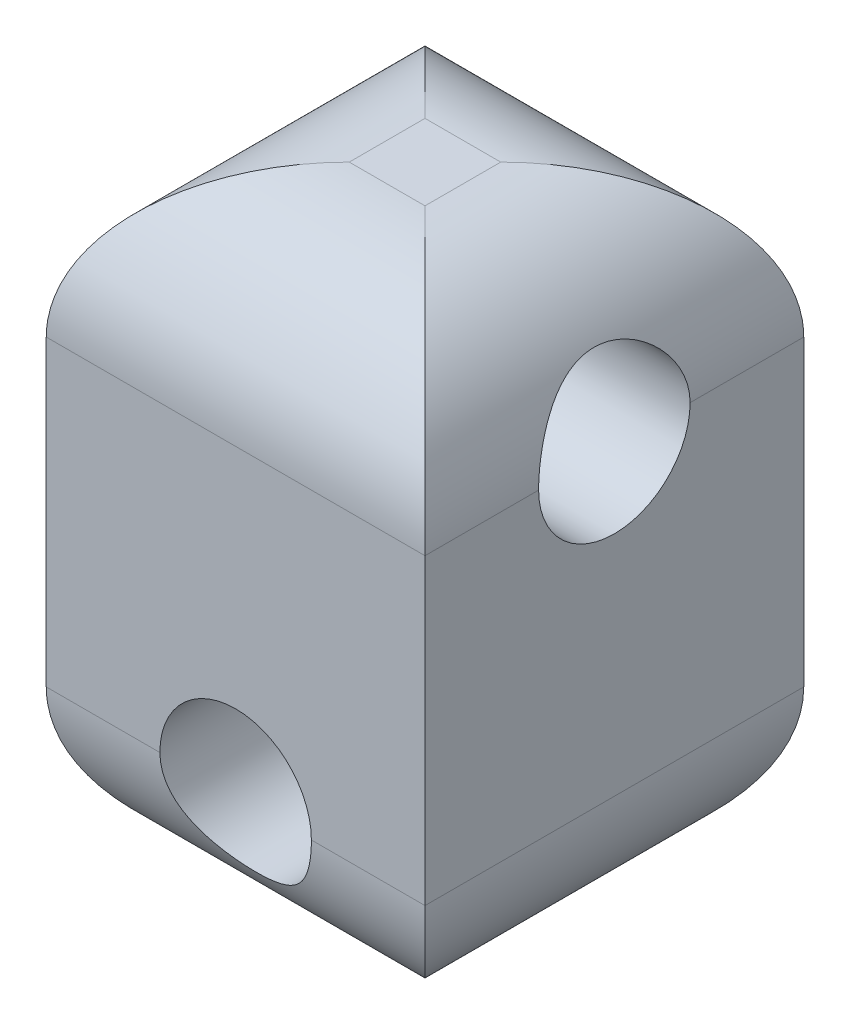
ISO-10303-21;
HEADER;
FILE_DESCRIPTION(('STEP AP214'),'2;1');
FILE_NAME('part.step','',(''),(''),'','','');
FILE_SCHEMA(('AUTOMOTIVE_DESIGN { 1 0 10303 214 1 1 1 1 }'));
ENDSEC;
DATA;
#1=APPLICATION_CONTEXT('core data for automotive mechanical design processes');
#2=APPLICATION_PROTOCOL_DEFINITION('international standard','automotive_design',2000,#1);
#3=PRODUCT_CONTEXT('',#1,'mechanical');
#4=PRODUCT('Part','Part','',(#3));
#5=PRODUCT_RELATED_PRODUCT_CATEGORY('part','',(#4));
#6=PRODUCT_DEFINITION_FORMATION('','',#4);
#7=PRODUCT_DEFINITION_CONTEXT('part definition',#1,'design');
#8=PRODUCT_DEFINITION('design','',#6,#7);
#9=PRODUCT_DEFINITION_SHAPE('','',#8);
#10=(LENGTH_UNIT() NAMED_UNIT(*) SI_UNIT(.MILLI.,.METRE.));
#11=(NAMED_UNIT(*) PLANE_ANGLE_UNIT() SI_UNIT($,.RADIAN.));
#12=(NAMED_UNIT(*) SI_UNIT($,.STERADIAN.) SOLID_ANGLE_UNIT());
#13=UNCERTAINTY_MEASURE_WITH_UNIT(LENGTH_MEASURE(1.E-05),#10,'distance_accuracy_value','');
#14=(GEOMETRIC_REPRESENTATION_CONTEXT(3) GLOBAL_UNCERTAINTY_ASSIGNED_CONTEXT((#13)) GLOBAL_UNIT_ASSIGNED_CONTEXT((#10,
#11,#12)) REPRESENTATION_CONTEXT('',''));
#15=CARTESIAN_POINT('',(0.,0.,0.));
#16=DIRECTION('',(0.,0.,1.));
#17=DIRECTION('',(1.,0.,0.));
#18=AXIS2_PLACEMENT_3D('',#15,#16,#17);
#19=CARTESIAN_POINT('',(-3.31347299634826,5.72314049586777,2.5));
#20=DIRECTION('',(1.,0.,0.));
#21=DIRECTION('',(0.,1.,0.));
#22=AXIS2_PLACEMENT_3D('',#19,#20,#21);
#23=PLANE('',#22);
#24=DIRECTION('',(0.,-1.,0.));
#25=VECTOR('',#24,1.);
#26=CARTESIAN_POINT('',(-3.31347299634826,5.72314049586777,2.5));
#27=LINE('',#26,#25);
#28=CARTESIAN_POINT('',(-3.31347299634826,4.72314049586777,2.5));
#29=VERTEX_POINT('',#28);
#30=CARTESIAN_POINT('',(-3.31347299634825,2.72314049586777,2.5));
#31=VERTEX_POINT('',#30);
#32=EDGE_CURVE('E341',#29,#31,#27,.T.);
#33=ORIENTED_EDGE('',*,*,#32,.F.);
#34=DIRECTION('',(0.,0.,-1.));
#35=VECTOR('',#34,1.);
#36=CARTESIAN_POINT('',(-3.31347299634826,4.72314049586777,2.5));
#37=LINE('',#36,#35);
#38=CARTESIAN_POINT('',(-3.31347299634825,4.72314049586777,1.75));
#39=VERTEX_POINT('',#38);
#40=EDGE_CURVE('E147',#29,#39,#37,.T.);
#41=ORIENTED_EDGE('',*,*,#40,.T.);
#42=CARTESIAN_POINT('',(-3.31347299634825,4.72314049586777,1.25));
#43=DIRECTION('',(1.,0.,0.));
#44=DIRECTION('',(0.,1.,0.));
#45=AXIS2_PLACEMENT_3D('',#42,#43,#44);
#46=CIRCLE('',#45,0.500000000000001);
#47=CARTESIAN_POINT('',(-3.31347299634825,4.72314049586777,0.749999999999999));
#48=VERTEX_POINT('',#47);
#49=EDGE_CURVE('E143',#39,#48,#46,.T.);
#50=ORIENTED_EDGE('',*,*,#49,.T.);
#51=DIRECTION('',(0.,0.,-1.));
#52=VECTOR('',#51,1.);
#53=CARTESIAN_POINT('',(-3.31347299634826,4.72314049586777,2.5));
#54=LINE('',#53,#52);
#55=CARTESIAN_POINT('',(-3.31347299634826,4.72314049586777,0.));
#56=VERTEX_POINT('',#55);
#57=EDGE_CURVE('E136',#48,#56,#54,.T.);
#58=ORIENTED_EDGE('',*,*,#57,.T.);
#59=DIRECTION('',(0.,-1.,0.));
#60=VECTOR('',#59,1.);
#61=CARTESIAN_POINT('',(-3.31347299634826,5.72314049586777,0.));
#62=LINE('',#61,#60);
#63=CARTESIAN_POINT('',(-3.31347299634825,2.72314049586777,0.));
#64=VERTEX_POINT('',#63);
#65=EDGE_CURVE('E140',#56,#64,#62,.T.);
#66=ORIENTED_EDGE('',*,*,#65,.T.);
#67=DIRECTION('',(0.,0.,-1.));
#68=VECTOR('',#67,1.);
#69=CARTESIAN_POINT('',(-3.31347299634825,2.72314049586777,2.5));
#70=LINE('',#69,#68);
#71=EDGE_CURVE('E169',#64,#31,#70,.F.);
#72=ORIENTED_EDGE('',*,*,#71,.T.);
#73=EDGE_LOOP('',(#33,#41,#50,#58,#66,#72));
#74=FACE_BOUND('',#73,.T.);
#75=ADVANCED_FACE('F43',(#74),#23,.F.);
#76=CARTESIAN_POINT('',(-3.31347299634825,1.72314049586777,2.5));
#77=DIRECTION('',(0.,1.,0.));
#78=DIRECTION('',(0.,0.,1.));
#79=AXIS2_PLACEMENT_3D('',#76,#77,#78);
#80=PLANE('',#79);
#81=DIRECTION('',(0.,0.,-1.));
#82=VECTOR('',#81,1.);
#83=CARTESIAN_POINT('',(-1.81347299634825,1.72314049586777,2.5));
#84=LINE('',#83,#82);
#85=CARTESIAN_POINT('',(-1.81347299634825,1.72314049586777,1.));
#86=VERTEX_POINT('',#85);
#87=CARTESIAN_POINT('',(-1.81347299634825,1.72314049586777,1.5));
#88=VERTEX_POINT('',#87);
#89=EDGE_CURVE('E329',#86,#88,#84,.F.);
#90=ORIENTED_EDGE('',*,*,#89,.T.);
#91=DIRECTION('',(1.,0.,0.));
#92=VECTOR('',#91,1.);
#93=CARTESIAN_POINT('',(-2.31347299634825,1.72314049586777,1.5));
#94=LINE('',#93,#92);
#95=CARTESIAN_POINT('',(-2.31347299634825,1.72314049586777,1.5));
#96=VERTEX_POINT('',#95);
#97=EDGE_CURVE('E67',#88,#96,#94,.F.);
#98=ORIENTED_EDGE('',*,*,#97,.T.);
#99=DIRECTION('',(0.,0.,-1.));
#100=VECTOR('',#99,1.);
#101=CARTESIAN_POINT('',(-2.31347299634825,1.72314049586777,2.5));
#102=LINE('',#101,#100);
#103=CARTESIAN_POINT('',(-2.31347299634825,1.72314049586777,1.));
#104=VERTEX_POINT('',#103);
#105=EDGE_CURVE('E170',#96,#104,#102,.T.);
#106=ORIENTED_EDGE('',*,*,#105,.T.);
#107=DIRECTION('',(1.,0.,0.));
#108=VECTOR('',#107,1.);
#109=CARTESIAN_POINT('',(-3.31347299634825,1.72314049586777,1.));
#110=LINE('',#109,#108);
#111=EDGE_CURVE('E319',#104,#86,#110,.T.);
#112=ORIENTED_EDGE('',*,*,#111,.T.);
#113=EDGE_LOOP('',(#90,#98,#106,#112));
#114=FACE_BOUND('',#113,.T.);
#115=ADVANCED_FACE('F233',(#114),#80,.F.);
#116=CARTESIAN_POINT('',(-0.813472996348255,5.72314049586777,2.5));
#117=DIRECTION('',(-1.,0.,0.));
#118=DIRECTION('',(0.,-1.,0.));
#119=AXIS2_PLACEMENT_3D('',#116,#117,#118);
#120=PLANE('',#119);
#121=DIRECTION('',(0.,1.,0.));
#122=VECTOR('',#121,1.);
#123=CARTESIAN_POINT('',(-0.813472996348255,5.72314049586777,0.));
#124=LINE('',#123,#122);
#125=CARTESIAN_POINT('',(-0.813472996348255,2.72314049586777,0.));
#126=VERTEX_POINT('',#125);
#127=CARTESIAN_POINT('',(-0.813472996348255,4.72314049586777,0.));
#128=VERTEX_POINT('',#127);
#129=EDGE_CURVE('E160',#126,#128,#124,.T.);
#130=ORIENTED_EDGE('',*,*,#129,.T.);
#131=DIRECTION('',(0.,0.,-1.));
#132=VECTOR('',#131,1.);
#133=CARTESIAN_POINT('',(-0.813472996348255,4.72314049586777,2.5));
#134=LINE('',#133,#132);
#135=CARTESIAN_POINT('',(-0.813472996348255,4.72314049586777,0.749999999999999));
#136=VERTEX_POINT('',#135);
#137=EDGE_CURVE('E189',#128,#136,#134,.F.);
#138=ORIENTED_EDGE('',*,*,#137,.T.);
#139=CARTESIAN_POINT('',(-0.813472996348255,4.72314049586777,1.25));
#140=DIRECTION('',(1.,0.,0.));
#141=DIRECTION('',(0.,1.,0.));
#142=AXIS2_PLACEMENT_3D('',#139,#140,#141);
#143=CIRCLE('',#142,0.500000000000001);
#144=CARTESIAN_POINT('',(-0.813472996348255,4.72314049586777,1.75));
#145=VERTEX_POINT('',#144);
#146=EDGE_CURVE('E347',#145,#136,#143,.T.);
#147=ORIENTED_EDGE('',*,*,#146,.F.);
#148=DIRECTION('',(0.,0.,-1.));
#149=VECTOR('',#148,1.);
#150=CARTESIAN_POINT('',(-0.813472996348255,4.72314049586777,2.5));
#151=LINE('',#150,#149);
#152=CARTESIAN_POINT('',(-0.813472996348255,4.72314049586777,2.5));
#153=VERTEX_POINT('',#152);
#154=EDGE_CURVE('E181',#145,#153,#151,.F.);
#155=ORIENTED_EDGE('',*,*,#154,.T.);
#156=DIRECTION('',(0.,1.,0.));
#157=VECTOR('',#156,1.);
#158=CARTESIAN_POINT('',(-0.813472996348255,5.72314049586777,2.5));
#159=LINE('',#158,#157);
#160=CARTESIAN_POINT('',(-0.813472996348255,2.72314049586777,2.5));
#161=VERTEX_POINT('',#160);
#162=EDGE_CURVE('E334',#161,#153,#159,.T.);
#163=ORIENTED_EDGE('',*,*,#162,.F.);
#164=DIRECTION('',(0.,0.,-1.));
#165=VECTOR('',#164,1.);
#166=CARTESIAN_POINT('',(-0.813472996348255,2.72314049586777,2.5));
#167=LINE('',#166,#165);
#168=EDGE_CURVE('E328',#161,#126,#167,.T.);
#169=ORIENTED_EDGE('',*,*,#168,.T.);
#170=EDGE_LOOP('',(#130,#138,#147,#155,#163,#169));
#171=FACE_BOUND('',#170,.T.);
#172=ADVANCED_FACE('F229',(#171),#120,.F.);
#173=CARTESIAN_POINT('',(-3.31347299634826,5.72314049586777,2.5));
#174=DIRECTION('',(0.,-1.,0.));
#175=DIRECTION('',(0.,0.,-1.));
#176=AXIS2_PLACEMENT_3D('',#173,#174,#175);
#177=PLANE('',#176);
#178=DIRECTION('',(-1.,0.,0.));
#179=VECTOR('',#178,1.);
#180=CARTESIAN_POINT('',(-0.813472996348255,5.72314049586777,1.5));
#181=LINE('',#180,#179);
#182=CARTESIAN_POINT('',(-2.31347299634826,5.72314049586777,1.5));
#183=VERTEX_POINT('',#182);
#184=CARTESIAN_POINT('',(-1.81347299634826,5.72314049586777,1.5));
#185=VERTEX_POINT('',#184);
#186=EDGE_CURVE('E336',#183,#185,#181,.F.);
#187=ORIENTED_EDGE('',*,*,#186,.T.);
#188=DIRECTION('',(0.,0.,-1.));
#189=VECTOR('',#188,1.);
#190=CARTESIAN_POINT('',(-1.81347299634825,5.72314049586777,2.5));
#191=LINE('',#190,#189);
#192=CARTESIAN_POINT('',(-1.81347299634825,5.72314049586777,1.));
#193=VERTEX_POINT('',#192);
#194=EDGE_CURVE('E177',#185,#193,#191,.T.);
#195=ORIENTED_EDGE('',*,*,#194,.T.);
#196=DIRECTION('',(-1.,0.,0.));
#197=VECTOR('',#196,1.);
#198=CARTESIAN_POINT('',(-3.31347299634826,5.72314049586777,1.));
#199=LINE('',#198,#197);
#200=CARTESIAN_POINT('',(-2.31347299634826,5.72314049586777,1.));
#201=VERTEX_POINT('',#200);
#202=EDGE_CURVE('E374',#193,#201,#199,.T.);
#203=ORIENTED_EDGE('',*,*,#202,.T.);
#204=DIRECTION('',(0.,0.,-1.));
#205=VECTOR('',#204,1.);
#206=CARTESIAN_POINT('',(-2.31347299634826,5.72314049586777,2.5));
#207=LINE('',#206,#205);
#208=EDGE_CURVE('E175',#201,#183,#207,.F.);
#209=ORIENTED_EDGE('',*,*,#208,.T.);
#210=EDGE_LOOP('',(#187,#195,#203,#209));
#211=FACE_BOUND('',#210,.T.);
#212=ADVANCED_FACE('F222',(#211),#177,.F.);
#213=CARTESIAN_POINT('',(0.,0.,2.5));
#214=DIRECTION('',(0.,0.,1.));
#215=DIRECTION('',(1.,0.,0.));
#216=AXIS2_PLACEMENT_3D('',#213,#214,#215);
#217=PLANE('',#216);
#218=ORIENTED_EDGE('',*,*,#32,.T.);
#219=DIRECTION('',(1.,0.,0.));
#220=VECTOR('',#219,1.);
#221=CARTESIAN_POINT('',(-1.81347299634825,2.72314049586777,2.5));
#222=LINE('',#221,#220);
#223=CARTESIAN_POINT('',(-2.56347299634825,2.72314049586777,2.5));
#224=VERTEX_POINT('',#223);
#225=EDGE_CURVE('E280',#31,#224,#222,.T.);
#226=ORIENTED_EDGE('',*,*,#225,.T.);
#227=CARTESIAN_POINT('',(-2.06347299634825,2.72314049586777,2.5));
#228=DIRECTION('',(0.,0.,1.));
#229=DIRECTION('',(1.,0.,0.));
#230=AXIS2_PLACEMENT_3D('',#227,#228,#229);
#231=CIRCLE('',#230,0.5);
#232=CARTESIAN_POINT('',(-1.56347299634825,2.72314049586777,2.5));
#233=VERTEX_POINT('',#232);
#234=EDGE_CURVE('E348',#233,#224,#231,.T.);
#235=ORIENTED_EDGE('',*,*,#234,.F.);
#236=DIRECTION('',(1.,0.,0.));
#237=VECTOR('',#236,1.);
#238=CARTESIAN_POINT('',(-1.81347299634825,2.72314049586777,2.5));
#239=LINE('',#238,#237);
#240=EDGE_CURVE('E277',#233,#161,#239,.T.);
#241=ORIENTED_EDGE('',*,*,#240,.T.);
#242=ORIENTED_EDGE('',*,*,#162,.T.);
#243=DIRECTION('',(-1.,0.,0.));
#244=VECTOR('',#243,1.);
#245=CARTESIAN_POINT('',(-3.31347299634826,4.72314049586777,2.5));
#246=LINE('',#245,#244);
#247=EDGE_CURVE('E337',#153,#29,#246,.T.);
#248=ORIENTED_EDGE('',*,*,#247,.T.);
#249=EDGE_LOOP('',(#218,#226,#235,#241,#242,#248));
#250=FACE_BOUND('',#249,.T.);
#251=ADVANCED_FACE('F218',(#250),#217,.T.);
#252=CARTESIAN_POINT('',(0.,0.,0.));
#253=DIRECTION('',(0.,0.,1.));
#254=DIRECTION('',(1.,0.,0.));
#255=AXIS2_PLACEMENT_3D('',#252,#253,#254);
#256=PLANE('',#255);
#257=ORIENTED_EDGE('',*,*,#129,.F.);
#258=DIRECTION('',(1.,0.,0.));
#259=VECTOR('',#258,1.);
#260=CARTESIAN_POINT('',(0.,2.72314049586777,0.));
#261=LINE('',#260,#259);
#262=CARTESIAN_POINT('',(-1.56347299634825,2.72314049586777,0.));
#263=VERTEX_POINT('',#262);
#264=EDGE_CURVE('E11',#126,#263,#261,.F.);
#265=ORIENTED_EDGE('',*,*,#264,.T.);
#266=CARTESIAN_POINT('',(-2.06347299634825,2.72314049586777,0.));
#267=DIRECTION('',(0.,0.,1.));
#268=DIRECTION('',(1.,0.,0.));
#269=AXIS2_PLACEMENT_3D('',#266,#267,#268);
#270=CIRCLE('',#269,0.5);
#271=CARTESIAN_POINT('',(-2.56347299634825,2.72314049586777,0.));
#272=VERTEX_POINT('',#271);
#273=EDGE_CURVE('E345',#263,#272,#270,.T.);
#274=ORIENTED_EDGE('',*,*,#273,.T.);
#275=DIRECTION('',(1.,0.,0.));
#276=VECTOR('',#275,1.);
#277=CARTESIAN_POINT('',(0.,2.72314049586777,0.));
#278=LINE('',#277,#276);
#279=EDGE_CURVE('E53',#272,#64,#278,.F.);
#280=ORIENTED_EDGE('',*,*,#279,.T.);
#281=ORIENTED_EDGE('',*,*,#65,.F.);
#282=DIRECTION('',(-1.,0.,0.));
#283=VECTOR('',#282,1.);
#284=CARTESIAN_POINT('',(0.,4.72314049586777,0.));
#285=LINE('',#284,#283);
#286=EDGE_CURVE('E155',#56,#128,#285,.F.);
#287=ORIENTED_EDGE('',*,*,#286,.T.);
#288=EDGE_LOOP('',(#257,#265,#274,#280,#281,#287));
#289=FACE_BOUND('',#288,.T.);
#290=ADVANCED_FACE('F154',(#289),#256,.F.);
#291=CARTESIAN_POINT('',(-2.31347299634825,2.72314049586777,2.5));
#292=DIRECTION('',(0.,0.,-1.));
#293=DIRECTION('',(-1.,0.,0.));
#294=AXIS2_PLACEMENT_3D('',#291,#292,#293);
#295=CYLINDRICAL_SURFACE('',#294,1.);
#296=ORIENTED_EDGE('',*,*,#105,.F.);
#297=CARTESIAN_POINT('',(-2.31347299634825,2.72314049586777,1.5));
#298=DIRECTION('',(-0.707106781186547,0.,-0.707106781186547));
#299=DIRECTION('',(0.707106781186547,0.,-0.707106781186547));
#300=AXIS2_PLACEMENT_3D('',#297,#298,#299);
#301=ELLIPSE('',#300,1.41421356237309,1.);
#302=EDGE_CURVE('E309',#96,#31,#301,.T.);
#303=ORIENTED_EDGE('',*,*,#302,.T.);
#304=ORIENTED_EDGE('',*,*,#71,.F.);
#305=CARTESIAN_POINT('',(-2.31347299634825,2.72314049586777,1.));
#306=DIRECTION('',(0.707106781186547,0.,-0.707106781186547));
#307=DIRECTION('',(-0.707106781186547,0.,-0.707106781186547));
#308=AXIS2_PLACEMENT_3D('',#305,#306,#307);
#309=ELLIPSE('',#308,1.41421356237309,1.);
#310=EDGE_CURVE('E60',#64,#104,#309,.F.);
#311=ORIENTED_EDGE('',*,*,#310,.T.);
#312=EDGE_LOOP('',(#296,#303,#304,#311));
#313=FACE_BOUND('',#312,.T.);
#314=ADVANCED_FACE('F226',(#313),#295,.T.);
#315=CARTESIAN_POINT('',(-1.81347299634825,2.72314049586777,2.5));
#316=DIRECTION('',(0.,0.,-1.));
#317=DIRECTION('',(-1.,0.,0.));
#318=AXIS2_PLACEMENT_3D('',#315,#316,#317);
#319=CYLINDRICAL_SURFACE('',#318,1.);
#320=ORIENTED_EDGE('',*,*,#168,.F.);
#321=CARTESIAN_POINT('',(-1.81347299634825,2.72314049586777,1.5));
#322=DIRECTION('',(0.707106781186547,0.,-0.707106781186547));
#323=DIRECTION('',(-0.707106781186547,0.,-0.707106781186547));
#324=AXIS2_PLACEMENT_3D('',#321,#322,#323);
#325=ELLIPSE('',#324,1.41421356237309,1.);
#326=EDGE_CURVE('E322',#161,#88,#325,.T.);
#327=ORIENTED_EDGE('',*,*,#326,.T.);
#328=ORIENTED_EDGE('',*,*,#89,.F.);
#329=CARTESIAN_POINT('',(-1.81347299634825,2.72314049586777,1.));
#330=DIRECTION('',(-0.707106781186547,0.,-0.707106781186547));
#331=DIRECTION('',(0.707106781186547,0.,-0.707106781186547));
#332=AXIS2_PLACEMENT_3D('',#329,#330,#331);
#333=ELLIPSE('',#332,1.41421356237309,1.);
#334=EDGE_CURVE('E298',#86,#126,#333,.F.);
#335=ORIENTED_EDGE('',*,*,#334,.T.);
#336=EDGE_LOOP('',(#320,#327,#328,#335));
#337=FACE_BOUND('',#336,.T.);
#338=ADVANCED_FACE('F241',(#337),#319,.T.);
#339=CARTESIAN_POINT('',(-3.31347299634826,4.72314049586777,1.));
#340=DIRECTION('',(-1.,0.,0.));
#341=DIRECTION('',(0.,0.,1.));
#342=AXIS2_PLACEMENT_3D('',#339,#340,#341);
#343=CYLINDRICAL_SURFACE('',#342,1.);
#344=ORIENTED_EDGE('',*,*,#202,.F.);
#345=CARTESIAN_POINT('',(-1.81347299634825,4.72314049586777,1.));
#346=DIRECTION('',(-0.707106781186547,0.,-0.707106781186547));
#347=DIRECTION('',(-0.707106781186547,0.,0.707106781186547));
#348=AXIS2_PLACEMENT_3D('',#345,#346,#347);
#349=ELLIPSE('',#348,1.41421356237309,1.);
#350=EDGE_CURVE('E167',#193,#128,#349,.T.);
#351=ORIENTED_EDGE('',*,*,#350,.T.);
#352=ORIENTED_EDGE('',*,*,#286,.F.);
#353=CARTESIAN_POINT('',(-2.31347299634826,4.72314049586777,1.));
#354=DIRECTION('',(-0.707106781186547,0.,0.707106781186547));
#355=DIRECTION('',(-0.707106781186547,0.,-0.707106781186547));
#356=AXIS2_PLACEMENT_3D('',#353,#354,#355);
#357=ELLIPSE('',#356,1.41421356237309,1.);
#358=EDGE_CURVE('E165',#56,#201,#357,.F.);
#359=ORIENTED_EDGE('',*,*,#358,.T.);
#360=EDGE_LOOP('',(#344,#351,#352,#359));
#361=FACE_BOUND('',#360,.T.);
#362=ADVANCED_FACE('F164',(#361),#343,.T.);
#363=CARTESIAN_POINT('',(0.,4.72314049586777,1.5));
#364=DIRECTION('',(1.,0.,0.));
#365=DIRECTION('',(0.,0.,-1.));
#366=AXIS2_PLACEMENT_3D('',#363,#364,#365);
#367=CYLINDRICAL_SURFACE('',#366,1.);
#368=ORIENTED_EDGE('',*,*,#247,.F.);
#369=CARTESIAN_POINT('',(-1.81347299634825,4.72314049586777,1.5));
#370=DIRECTION('',(0.707106781186547,0.,-0.707106781186547));
#371=DIRECTION('',(0.707106781186547,0.,0.707106781186547));
#372=AXIS2_PLACEMENT_3D('',#369,#370,#371);
#373=ELLIPSE('',#372,1.41421356237309,1.);
#374=EDGE_CURVE('E148',#153,#185,#373,.F.);
#375=ORIENTED_EDGE('',*,*,#374,.T.);
#376=ORIENTED_EDGE('',*,*,#186,.F.);
#377=CARTESIAN_POINT('',(-2.31347299634826,4.72314049586777,1.5));
#378=DIRECTION('',(0.707106781186547,0.,0.707106781186547));
#379=DIRECTION('',(0.707106781186547,0.,-0.707106781186547));
#380=AXIS2_PLACEMENT_3D('',#377,#378,#379);
#381=ELLIPSE('',#380,1.41421356237309,1.);
#382=EDGE_CURVE('E267',#183,#29,#381,.T.);
#383=ORIENTED_EDGE('',*,*,#382,.T.);
#384=EDGE_LOOP('',(#368,#375,#376,#383));
#385=FACE_BOUND('',#384,.T.);
#386=ADVANCED_FACE('F215',(#385),#367,.T.);
#387=CARTESIAN_POINT('',(-3.31347299634825,4.72314049586777,1.25));
#388=DIRECTION('',(1.,0.,0.));
#389=DIRECTION('',(0.,1.,0.));
#390=AXIS2_PLACEMENT_3D('',#387,#388,#389);
#391=CYLINDRICAL_SURFACE('',#390,0.500000000000001);
#392=ORIENTED_EDGE('',*,*,#49,.F.);
#393=CARTESIAN_POINT('',(-3.31347299634825,4.72314049586777,1.75));
#394=CARTESIAN_POINT('',(-3.31350788982379,4.74955143947998,1.75003072135397));
#395=CARTESIAN_POINT('',(-3.31242817628196,4.77592671258177,1.74790980159719));
#396=CARTESIAN_POINT('',(-3.30831429524502,4.82775755492798,1.73962465532118));
#397=CARTESIAN_POINT('',(-3.30528918091885,4.85321681042767,1.73347915527784));
#398=CARTESIAN_POINT('',(-3.29755906877521,4.9025965023922,1.71740976373107));
#399=CARTESIAN_POINT('',(-3.29285599259854,4.92651866234329,1.70749019352098));
#400=CARTESIAN_POINT('',(-3.28220762245017,4.97235235470129,1.68422852334636));
#401=CARTESIAN_POINT('',(-3.27626108813079,4.99426184782803,1.67088300295236));
#402=CARTESIAN_POINT('',(-3.2632541384616,5.03689577258751,1.64024072607548));
#403=CARTESIAN_POINT('',(-3.25614830580288,5.057470302831,1.62275498642502));
#404=CARTESIAN_POINT('',(-3.24177203874259,5.09553197560618,1.5847370797433));
#405=CARTESIAN_POINT('',(-3.23450149966422,5.11301708885208,1.56420292653219));
#406=CARTESIAN_POINT('',(-3.2199676789372,5.14576671505996,1.51875805962083));
#407=CARTESIAN_POINT('',(-3.21274876314168,5.16075352602408,1.49363135433372));
#408=CARTESIAN_POINT('',(-3.19990275101411,5.18622485587693,1.4408156661682));
#409=CARTESIAN_POINT('',(-3.19427448093223,5.19671269756505,1.41312859273426));
#410=CARTESIAN_POINT('',(-3.18576237940486,5.21220663272671,1.35766775413523));
#411=CARTESIAN_POINT('',(-3.18273442272654,5.21750330476496,1.32999840439092));
#412=CARTESIAN_POINT('',(-3.17938245409343,5.22335397879798,1.27401122553696));
#413=CARTESIAN_POINT('',(-3.17905583120895,5.22391256032947,1.24569404913209));
#414=CARTESIAN_POINT('',(-3.18102765758777,5.22048412244612,1.19285671947844));
#415=CARTESIAN_POINT('',(-3.18301685802805,5.21703270148934,1.16828745158444));
#416=CARTESIAN_POINT('',(-3.18885422330273,5.20661026837765,1.12013853337627));
#417=CARTESIAN_POINT('',(-3.19270294010071,5.1996382111582,1.09655917916014));
#418=CARTESIAN_POINT('',(-3.20191031378097,5.18224551119412,1.05038575730245));
#419=CARTESIAN_POINT('',(-3.20730204937228,5.17174833307723,1.02782742674658));
#420=CARTESIAN_POINT('',(-3.21898984474442,5.14766170229085,0.984683420811296));
#421=CARTESIAN_POINT('',(-3.22528633507084,5.13407077559033,0.964098692429759));
#422=CARTESIAN_POINT('',(-3.23903855694136,5.10217409906966,0.922740057517449));
#423=CARTESIAN_POINT('',(-3.24654006708582,5.08348909547107,0.902272861379986));
#424=CARTESIAN_POINT('',(-3.2612106872653,5.04291942153402,0.864633318159366));
#425=CARTESIAN_POINT('',(-3.26837961625548,5.02103303478796,0.84746275004132));
#426=CARTESIAN_POINT('',(-3.2819863871423,4.9733872589456,0.816149194593176));
#427=CARTESIAN_POINT('',(-3.28837412293653,4.94749430370101,0.802186132166686));
#428=CARTESIAN_POINT('',(-3.29926728187326,4.89334152434199,0.778941464892784));
#429=CARTESIAN_POINT('',(-3.30377608653965,4.86508606308617,0.769651443647738));
#430=CARTESIAN_POINT('',(-3.30916615896576,4.81769129927793,0.758656312586206));
#431=CARTESIAN_POINT('',(-3.31077042042591,4.79897641819765,0.755421259824821));
#432=CARTESIAN_POINT('',(-3.31292837372652,4.76122672628033,0.751089059385444));
#433=CARTESIAN_POINT('',(-3.31348121225643,4.74219166822248,0.749993648171646));
#434=CARTESIAN_POINT('',(-3.31347299634826,4.72314049586777,0.749999999999999));
#435=B_SPLINE_CURVE_WITH_KNOTS('',3,(#393,#394,#395,#396,#397,#398,#399,#400,#401,#402,#403,
#404,#405,#406,#407,#408,#409,#410,#411,#412,#413,#414,#415,#416,#417,#418,#419,#420,#421,#422,
#423,#424,#425,#426,#427,#428,#429,#430,#431,#432,#433,#434),.UNSPECIFIED.,.F.,.F.,(4,2,2,2,2,2,
2,2,2,2,2,2,2,2,2,2,2,2,2,2,4),(0.,0.0790696798558936,0.157774035821078,0.236388545538948,
0.315081850421874,0.398495175596329,0.481963088819586,0.571909672670743,0.661789709902213,
0.746289073897587,0.830706756868568,0.905029335830034,0.979373989662274,1.05545012161112,
1.13156257654031,1.21732203515647,1.30312764301931,1.39296054548354,1.48263106952233,
1.53966960678405,1.59675441548445),.UNSPECIFIED.);
#436=EDGE_CURVE('E192',#39,#48,#435,.T.);
#437=ORIENTED_EDGE('',*,*,#436,.T.);
#438=EDGE_LOOP('',(#392,#437));
#439=FACE_BOUND('',#438,.T.);
#440=ORIENTED_EDGE('',*,*,#146,.T.);
#441=CARTESIAN_POINT('',(-0.813472996348255,4.72314049586777,0.749999999999999));
#442=CARTESIAN_POINT('',(-0.813438102872717,4.74955143947998,0.749969278646028));
#443=CARTESIAN_POINT('',(-0.81451781641455,4.77592671258177,0.752090198402809));
#444=CARTESIAN_POINT('',(-0.818631697451487,4.82775755492798,0.760375344678821));
#445=CARTESIAN_POINT('',(-0.821656811777665,4.85321681042767,0.766520844722159));
#446=CARTESIAN_POINT('',(-0.829386923921297,4.9025965023922,0.782590236268932));
#447=CARTESIAN_POINT('',(-0.834090000097973,4.92651866234329,0.792509806479022));
#448=CARTESIAN_POINT('',(-0.844738370246343,4.97235235470129,0.815771476653635));
#449=CARTESIAN_POINT('',(-0.850684904565719,4.99426184782803,0.829116997047638));
#450=CARTESIAN_POINT('',(-0.863691854234907,5.03689577258751,0.859759273924515));
#451=CARTESIAN_POINT('',(-0.870797686893629,5.057470302831,0.877245013574983));
#452=CARTESIAN_POINT('',(-0.885173953953925,5.09553197560618,0.9152629202567));
#453=CARTESIAN_POINT('',(-0.892444493032292,5.11301708885207,0.93579707346781));
#454=CARTESIAN_POINT('',(-0.90697831375931,5.14576671505996,0.981241940379164));
#455=CARTESIAN_POINT('',(-0.914197229554829,5.16075352602408,1.00636864566628));
#456=CARTESIAN_POINT('',(-0.927043241682404,5.18622485587693,1.0591843338318));
#457=CARTESIAN_POINT('',(-0.932671511764279,5.19671269756505,1.08687140726573));
#458=CARTESIAN_POINT('',(-0.941183613291652,5.21220663272671,1.14233224586477));
#459=CARTESIAN_POINT('',(-0.944211569969966,5.21750330476496,1.17000159560908));
#460=CARTESIAN_POINT('',(-0.94756353860308,5.22335397879798,1.22598877446304));
#461=CARTESIAN_POINT('',(-0.947890161487561,5.22391256032947,1.25430595086791));
#462=CARTESIAN_POINT('',(-0.945918335108745,5.22048412244612,1.30714328052156));
#463=CARTESIAN_POINT('',(-0.943929134668463,5.21703270148934,1.33171254841555));
#464=CARTESIAN_POINT('',(-0.938091769393777,5.20661026837765,1.37986146662372));
#465=CARTESIAN_POINT('',(-0.934243052595796,5.1996382111582,1.40344082083986));
#466=CARTESIAN_POINT('',(-0.925035678915544,5.18224551119412,1.44961424269755));
#467=CARTESIAN_POINT('',(-0.919643943324235,5.17174833307723,1.47217257325342));
#468=CARTESIAN_POINT('',(-0.907956147952092,5.14766170229085,1.5153165791887));
#469=CARTESIAN_POINT('',(-0.901659657625668,5.13407077559033,1.53590130757024));
#470=CARTESIAN_POINT('',(-0.887907435755153,5.10217409906966,1.57725994248255));
#471=CARTESIAN_POINT('',(-0.880405925610691,5.08348909547107,1.59772713862001));
#472=CARTESIAN_POINT('',(-0.865735305431209,5.04291942153402,1.63536668184063));
#473=CARTESIAN_POINT('',(-0.858566376441028,5.02103303478796,1.65253724995868));
#474=CARTESIAN_POINT('',(-0.844959605554214,4.9733872589456,1.68385080540682));
#475=CARTESIAN_POINT('',(-0.838571869759977,4.94749430370102,1.69781386783331));
#476=CARTESIAN_POINT('',(-0.827678710823253,4.89334152434199,1.72105853510722));
#477=CARTESIAN_POINT('',(-0.823169906156857,4.86508606308617,1.73034855635226));
#478=CARTESIAN_POINT('',(-0.817779833730745,4.81769129927793,1.74134368741379));
#479=CARTESIAN_POINT('',(-0.816175572270605,4.79897641819766,1.74457874017518));
#480=CARTESIAN_POINT('',(-0.814017618969988,4.76122672628033,1.74891094061456));
#481=CARTESIAN_POINT('',(-0.813464780440079,4.74219166822248,1.75000635182835));
#482=CARTESIAN_POINT('',(-0.813472996348255,4.72314049586777,1.75));
#483=B_SPLINE_CURVE_WITH_KNOTS('',3,(#441,#442,#443,#444,#445,#446,#447,#448,#449,#450,#451,
#452,#453,#454,#455,#456,#457,#458,#459,#460,#461,#462,#463,#464,#465,#466,#467,#468,#469,#470,
#471,#472,#473,#474,#475,#476,#477,#478,#479,#480,#481,#482),.UNSPECIFIED.,.F.,.F.,(4,2,2,2,2,2,
2,2,2,2,2,2,2,2,2,2,2,2,2,2,4),(0.,0.0790696798558927,0.157774035821077,0.236388545538948,
0.315081850421874,0.398495175596329,0.481963088819584,0.571909672670742,0.661789709902211,
0.746289073897586,0.830706756868567,0.905029335830032,0.979373989662274,1.05545012161112,
1.13156257654031,1.21732203515647,1.30312764301931,1.39296054548354,1.48263106952233,
1.53966960678405,1.59675441548446),.UNSPECIFIED.);
#484=EDGE_CURVE('E201',#136,#145,#483,.T.);
#485=ORIENTED_EDGE('',*,*,#484,.T.);
#486=EDGE_LOOP('',(#440,#485));
#487=FACE_BOUND('',#486,.T.);
#488=ADVANCED_FACE('F209',(#439,#487),#391,.F.);
#489=CARTESIAN_POINT('',(-2.06347299634825,2.72314049586777,0.));
#490=DIRECTION('',(0.,0.,1.));
#491=DIRECTION('',(1.,0.,0.));
#492=AXIS2_PLACEMENT_3D('',#489,#490,#491);
#493=CYLINDRICAL_SURFACE('',#492,0.5);
#494=ORIENTED_EDGE('',*,*,#273,.F.);
#495=CARTESIAN_POINT('',(-1.56347299634825,2.72314049586777,0.));
#496=CARTESIAN_POINT('',(-1.56344227499428,2.69672955225555,-3.4893475537721E-05));
#497=CARTESIAN_POINT('',(-1.56556319475106,2.67035427915376,0.00104482006629539));
#498=CARTESIAN_POINT('',(-1.57384834102708,2.61852343680755,0.00515870110323195));
#499=CARTESIAN_POINT('',(-1.57999384107041,2.59306418130786,0.00818381542940993));
#500=CARTESIAN_POINT('',(-1.59606323261719,2.54368448934334,0.0159139275730419));
#501=CARTESIAN_POINT('',(-1.60598280282728,2.51976232939225,0.0206170037497176));
#502=CARTESIAN_POINT('',(-1.62924447300189,2.47392863703424,0.0312653738980874));
#503=CARTESIAN_POINT('',(-1.64258999339589,2.45201914390751,0.0372119082174641));
#504=CARTESIAN_POINT('',(-1.67323227027277,2.40938521914803,0.0502188578866517));
#505=CARTESIAN_POINT('',(-1.69071800992324,2.38881068890453,0.0573246905453738));
#506=CARTESIAN_POINT('',(-1.72873591660496,2.35074901612936,0.0717009576056699));
#507=CARTESIAN_POINT('',(-1.74927006981607,2.33326390288346,0.0789714966840375));
#508=CARTESIAN_POINT('',(-1.79471493672742,2.30051427667558,0.0935053174110548));
#509=CARTESIAN_POINT('',(-1.81984164201454,2.28552746571146,0.100724233206574));
#510=CARTESIAN_POINT('',(-1.87265733018005,2.26005613585861,0.113570245334149));
#511=CARTESIAN_POINT('',(-1.90034440361399,2.24956829417049,0.119198515416024));
#512=CARTESIAN_POINT('',(-1.95580524221303,2.23407435900883,0.127710616943397));
#513=CARTESIAN_POINT('',(-1.98347459195734,2.22877768697058,0.130738573621711));
#514=CARTESIAN_POINT('',(-2.0394617708113,2.22292701293755,0.134090542254825));
#515=CARTESIAN_POINT('',(-2.06777894721616,2.22236843140607,0.134417165139305));
#516=CARTESIAN_POINT('',(-2.12061627686982,2.22579686928941,0.132445338760489));
#517=CARTESIAN_POINT('',(-2.14518554476381,2.22924829024619,0.130456138320208));
#518=CARTESIAN_POINT('',(-2.19333446297198,2.23967072335789,0.124618773045522));
#519=CARTESIAN_POINT('',(-2.21691381718812,2.24664278057734,0.120770056247541));
#520=CARTESIAN_POINT('',(-2.26308723904581,2.26403548054141,0.111562682567288));
#521=CARTESIAN_POINT('',(-2.28564556960167,2.2745326586583,0.10617094697598));
#522=CARTESIAN_POINT('',(-2.32878957553696,2.29861928944468,0.0944831516038362));
#523=CARTESIAN_POINT('',(-2.34937430391849,2.31221021614521,0.0881866612774127));
#524=CARTESIAN_POINT('',(-2.3907329388308,2.34410689266588,0.0744344394068975));
#525=CARTESIAN_POINT('',(-2.41120013496827,2.36279189626446,0.0669329292624354));
#526=CARTESIAN_POINT('',(-2.44883967818889,2.40336157020152,0.0522623090829536));
#527=CARTESIAN_POINT('',(-2.46601024630693,2.42524795694757,0.0450933800927728));
#528=CARTESIAN_POINT('',(-2.49732380175508,2.47289373278993,0.0314866092059586));
#529=CARTESIAN_POINT('',(-2.51128686418157,2.49878668803452,0.0250988734117219));
#530=CARTESIAN_POINT('',(-2.53453153145547,2.55293946739354,0.0142057144749983));
#531=CARTESIAN_POINT('',(-2.54382155270052,2.58119492864936,0.00969690980860238));
#532=CARTESIAN_POINT('',(-2.55481668376205,2.62858969245761,0.00430683738249039));
#533=CARTESIAN_POINT('',(-2.55805173652343,2.64730457353788,0.00270257592235003));
#534=CARTESIAN_POINT('',(-2.56238393696281,2.6850542654552,0.000544622621732899));
#535=CARTESIAN_POINT('',(-2.56347934817661,2.70408932351306,-8.21590817586839E-06));
#536=CARTESIAN_POINT('',(-2.56347299634825,2.72314049586777,0.));
#537=B_SPLINE_CURVE_WITH_KNOTS('',3,(#495,#496,#497,#498,#499,#500,#501,#502,#503,#504,#505,
#506,#507,#508,#509,#510,#511,#512,#513,#514,#515,#516,#517,#518,#519,#520,#521,#522,#523,#524,
#525,#526,#527,#528,#529,#530,#531,#532,#533,#534,#535,#536),.UNSPECIFIED.,.F.,.F.,(4,2,2,2,2,2,
2,2,2,2,2,2,2,2,2,2,2,2,2,2,4),(0.,0.0790696798558927,0.157774035821077,0.236388545538947,
0.315081850421874,0.398495175596329,0.481963088819585,0.571909672670742,0.661789709902211,
0.746289073897585,0.830706756868567,0.905029335830032,0.979373989662272,1.05545012161112,
1.13156257654031,1.21732203515647,1.30312764301931,1.39296054548354,1.48263106952233,
1.53966960678405,1.59675441548445),.UNSPECIFIED.);
#538=EDGE_CURVE('E284',#263,#272,#537,.T.);
#539=ORIENTED_EDGE('',*,*,#538,.T.);
#540=EDGE_LOOP('',(#494,#539));
#541=FACE_BOUND('',#540,.T.);
#542=ORIENTED_EDGE('',*,*,#234,.T.);
#543=CARTESIAN_POINT('',(-2.56347299634825,2.72314049586777,2.5));
#544=CARTESIAN_POINT('',(-2.56350371770223,2.69672955225555,2.50003489347554));
#545=CARTESIAN_POINT('',(-2.56138279794545,2.67035427915376,2.4989551799337));
#546=CARTESIAN_POINT('',(-2.55309765166943,2.61852343680755,2.49484129889677));
#547=CARTESIAN_POINT('',(-2.54695215162609,2.59306418130786,2.49181618457059));
#548=CARTESIAN_POINT('',(-2.53088276007932,2.54368448934334,2.48408607242696));
#549=CARTESIAN_POINT('',(-2.52096318986923,2.51976232939225,2.47938299625028));
#550=CARTESIAN_POINT('',(-2.49770151969462,2.47392863703424,2.46873462610191));
#551=CARTESIAN_POINT('',(-2.48435599930062,2.45201914390751,2.46278809178254));
#552=CARTESIAN_POINT('',(-2.45371372242374,2.40938521914803,2.44978114211335));
#553=CARTESIAN_POINT('',(-2.43622798277327,2.38881068890453,2.44267530945463));
#554=CARTESIAN_POINT('',(-2.39821007609155,2.35074901612936,2.42829904239433));
#555=CARTESIAN_POINT('',(-2.37767592288044,2.33326390288346,2.42102850331596));
#556=CARTESIAN_POINT('',(-2.33223105596909,2.30051427667558,2.40649468258895));
#557=CARTESIAN_POINT('',(-2.30710435068197,2.28552746571146,2.39927576679343));
#558=CARTESIAN_POINT('',(-2.25428866251646,2.26005613585861,2.38642975466585));
#559=CARTESIAN_POINT('',(-2.22660158908252,2.24956829417049,2.38080148458398));
#560=CARTESIAN_POINT('',(-2.17114075048348,2.23407435900883,2.3722893830566));
#561=CARTESIAN_POINT('',(-2.14347140073917,2.22877768697058,2.36926142637829));
#562=CARTESIAN_POINT('',(-2.08748422188521,2.22292701293755,2.36590945774518));
#563=CARTESIAN_POINT('',(-2.05916704548034,2.22236843140607,2.36558283486069));
#564=CARTESIAN_POINT('',(-2.00632971582669,2.22579686928941,2.36755466123951));
#565=CARTESIAN_POINT('',(-1.9817604479327,2.22924829024619,2.36954386167979));
#566=CARTESIAN_POINT('',(-1.93361152972453,2.23967072335789,2.37538122695448));
#567=CARTESIAN_POINT('',(-1.91003217550839,2.24664278057734,2.37922994375246));
#568=CARTESIAN_POINT('',(-1.8638587536507,2.26403548054141,2.38843731743271));
#569=CARTESIAN_POINT('',(-1.84130042309483,2.2745326586583,2.39382905302402));
#570=CARTESIAN_POINT('',(-1.79815641715955,2.29861928944469,2.40551684839616));
#571=CARTESIAN_POINT('',(-1.77757168877801,2.31221021614521,2.41181333872259));
#572=CARTESIAN_POINT('',(-1.7362130538657,2.34410689266588,2.4255655605931));
#573=CARTESIAN_POINT('',(-1.71574585772824,2.36279189626446,2.43306707073756));
#574=CARTESIAN_POINT('',(-1.67810631450762,2.40336157020152,2.44773769091705));
#575=CARTESIAN_POINT('',(-1.66093574638958,2.42524795694757,2.45490661990723));
#576=CARTESIAN_POINT('',(-1.62962219094143,2.47289373278993,2.46851339079404));
#577=CARTESIAN_POINT('',(-1.61565912851494,2.49878668803452,2.47490112658828));
#578=CARTESIAN_POINT('',(-1.59241446124104,2.55293946739354,2.485794285525));
#579=CARTESIAN_POINT('',(-1.58312443999599,2.58119492864936,2.4903030901914));
#580=CARTESIAN_POINT('',(-1.57212930893446,2.62858969245761,2.49569316261751));
#581=CARTESIAN_POINT('',(-1.56889425617308,2.64730457353788,2.49729742407765));
#582=CARTESIAN_POINT('',(-1.5645620557337,2.6850542654552,2.49945537737827));
#583=CARTESIAN_POINT('',(-1.5634666445199,2.70408932351306,2.50000821590818));
#584=CARTESIAN_POINT('',(-1.56347299634825,2.72314049586777,2.5));
#585=B_SPLINE_CURVE_WITH_KNOTS('',3,(#543,#544,#545,#546,#547,#548,#549,#550,#551,#552,#553,
#554,#555,#556,#557,#558,#559,#560,#561,#562,#563,#564,#565,#566,#567,#568,#569,#570,#571,#572,
#573,#574,#575,#576,#577,#578,#579,#580,#581,#582,#583,#584),.UNSPECIFIED.,.F.,.F.,(4,2,2,2,2,2,
2,2,2,2,2,2,2,2,2,2,2,2,2,2,4),(0.,0.0790696798558927,0.157774035821077,0.236388545538947,
0.315081850421874,0.398495175596328,0.481963088819585,0.571909672670742,0.661789709902211,
0.746289073897585,0.830706756868567,0.905029335830032,0.979373989662272,1.05545012161112,
1.13156257654031,1.21732203515647,1.30312764301931,1.39296054548354,1.48263106952233,
1.53966960678405,1.59675441548445),.UNSPECIFIED.);
#586=EDGE_CURVE('E291',#224,#233,#585,.T.);
#587=ORIENTED_EDGE('',*,*,#586,.T.);
#588=EDGE_LOOP('',(#542,#587));
#589=FACE_BOUND('',#588,.T.);
#590=ADVANCED_FACE('F214',(#541,#589),#493,.F.);
#591=CARTESIAN_POINT('',(-1.81347299634825,4.72314049586777,2.5));
#592=DIRECTION('',(0.,0.,-1.));
#593=DIRECTION('',(-1.,0.,0.));
#594=AXIS2_PLACEMENT_3D('',#591,#592,#593);
#595=CYLINDRICAL_SURFACE('',#594,1.);
#596=ORIENTED_EDGE('',*,*,#484,.F.);
#597=ORIENTED_EDGE('',*,*,#137,.F.);
#598=ORIENTED_EDGE('',*,*,#350,.F.);
#599=ORIENTED_EDGE('',*,*,#194,.F.);
#600=ORIENTED_EDGE('',*,*,#374,.F.);
#601=ORIENTED_EDGE('',*,*,#154,.F.);
#602=EDGE_LOOP('',(#596,#597,#598,#599,#600,#601));
#603=FACE_BOUND('',#602,.T.);
#604=ADVANCED_FACE('F249',(#603),#595,.T.);
#605=CARTESIAN_POINT('',(-2.31347299634826,4.72314049586777,2.5));
#606=DIRECTION('',(0.,0.,-1.));
#607=DIRECTION('',(-1.,0.,0.));
#608=AXIS2_PLACEMENT_3D('',#605,#606,#607);
#609=CYLINDRICAL_SURFACE('',#608,1.);
#610=ORIENTED_EDGE('',*,*,#382,.F.);
#611=ORIENTED_EDGE('',*,*,#208,.F.);
#612=ORIENTED_EDGE('',*,*,#358,.F.);
#613=ORIENTED_EDGE('',*,*,#57,.F.);
#614=ORIENTED_EDGE('',*,*,#436,.F.);
#615=ORIENTED_EDGE('',*,*,#40,.F.);
#616=EDGE_LOOP('',(#610,#611,#612,#613,#614,#615));
#617=FACE_BOUND('',#616,.T.);
#618=ADVANCED_FACE('F174',(#617),#609,.T.);
#619=CARTESIAN_POINT('',(0.,2.72314049586777,1.5));
#620=DIRECTION('',(-1.,0.,0.));
#621=DIRECTION('',(0.,0.,1.));
#622=AXIS2_PLACEMENT_3D('',#619,#620,#621);
#623=CYLINDRICAL_SURFACE('',#622,1.);
#624=ORIENTED_EDGE('',*,*,#302,.F.);
#625=ORIENTED_EDGE('',*,*,#97,.F.);
#626=ORIENTED_EDGE('',*,*,#326,.F.);
#627=ORIENTED_EDGE('',*,*,#240,.F.);
#628=ORIENTED_EDGE('',*,*,#586,.F.);
#629=ORIENTED_EDGE('',*,*,#225,.F.);
#630=EDGE_LOOP('',(#624,#625,#626,#627,#628,#629));
#631=FACE_BOUND('',#630,.T.);
#632=ADVANCED_FACE('F257',(#631),#623,.T.);
#633=CARTESIAN_POINT('',(-3.31347299634825,2.72314049586777,1.));
#634=DIRECTION('',(1.,0.,0.));
#635=DIRECTION('',(0.,0.,-1.));
#636=AXIS2_PLACEMENT_3D('',#633,#634,#635);
#637=CYLINDRICAL_SURFACE('',#636,1.);
#638=ORIENTED_EDGE('',*,*,#538,.F.);
#639=ORIENTED_EDGE('',*,*,#264,.F.);
#640=ORIENTED_EDGE('',*,*,#334,.F.);
#641=ORIENTED_EDGE('',*,*,#111,.F.);
#642=ORIENTED_EDGE('',*,*,#310,.F.);
#643=ORIENTED_EDGE('',*,*,#279,.F.);
#644=EDGE_LOOP('',(#638,#639,#640,#641,#642,#643));
#645=FACE_BOUND('',#644,.T.);
#646=ADVANCED_FACE('F45',(#645),#637,.T.);
#647=CLOSED_SHELL('',(#75,#115,#172,#212,#251,#290,#314,#338,#362,#386,#488,#590,#604,#618,#632,#646));
#648=MANIFOLD_SOLID_BREP('B2',#647);
#649=ADVANCED_BREP_SHAPE_REPRESENTATION('',(#18,#648),#14);
#650=SHAPE_DEFINITION_REPRESENTATION(#9,#649);
ENDSEC;
END-ISO-10303-21;
